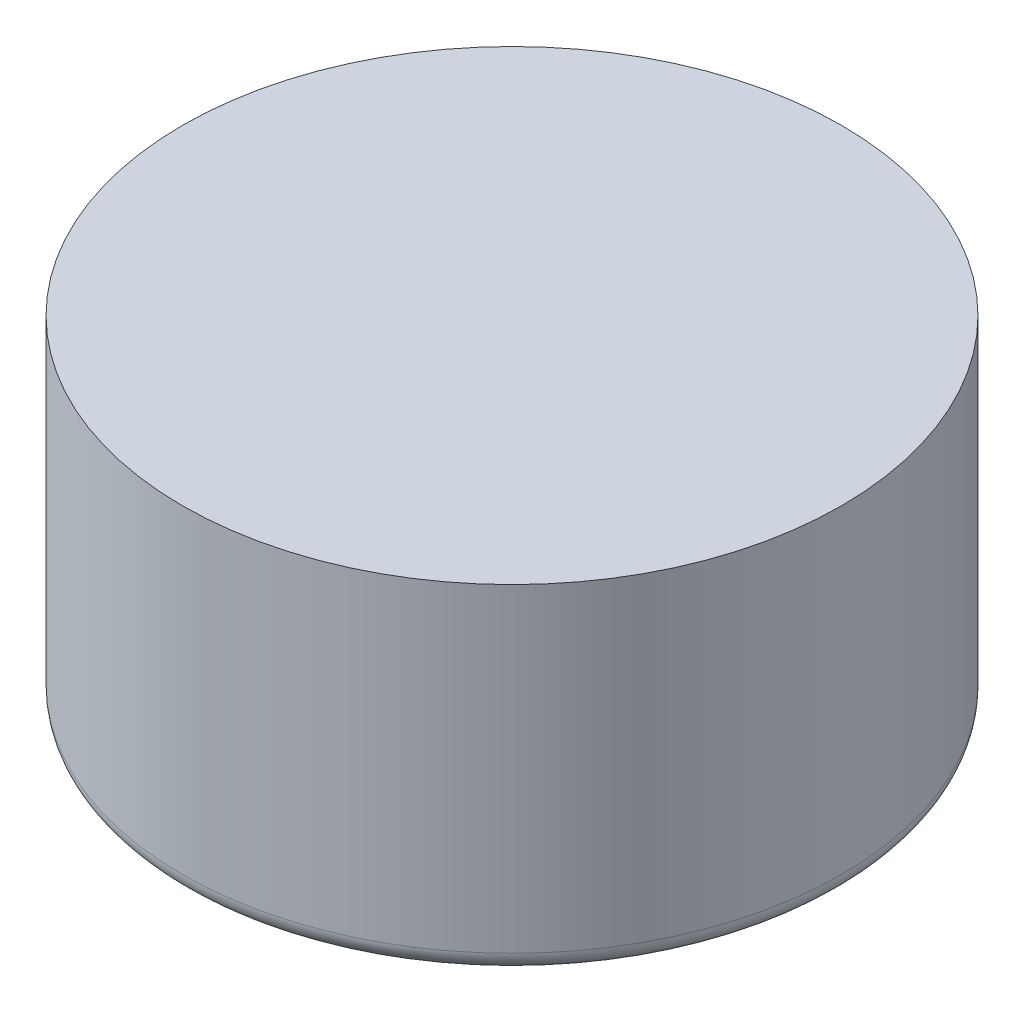
ISO-10303-21;
HEADER;
FILE_DESCRIPTION(('STEP AP214'),'2;1');
FILE_NAME('part.step','',(''),(''),'','','');
FILE_SCHEMA(('AUTOMOTIVE_DESIGN { 1 0 10303 214 1 1 1 1 }'));
ENDSEC;
DATA;
#1=APPLICATION_CONTEXT('core data for automotive mechanical design processes');
#2=APPLICATION_PROTOCOL_DEFINITION('international standard','automotive_design',2000,#1);
#3=PRODUCT_CONTEXT('',#1,'mechanical');
#4=PRODUCT('Part','Part','',(#3));
#5=PRODUCT_RELATED_PRODUCT_CATEGORY('part','',(#4));
#6=PRODUCT_DEFINITION_FORMATION('','',#4);
#7=PRODUCT_DEFINITION_CONTEXT('part definition',#1,'design');
#8=PRODUCT_DEFINITION('design','',#6,#7);
#9=PRODUCT_DEFINITION_SHAPE('','',#8);
#10=(LENGTH_UNIT() NAMED_UNIT(*) SI_UNIT(.MILLI.,.METRE.));
#11=(NAMED_UNIT(*) PLANE_ANGLE_UNIT() SI_UNIT($,.RADIAN.));
#12=(NAMED_UNIT(*) SI_UNIT($,.STERADIAN.) SOLID_ANGLE_UNIT());
#13=UNCERTAINTY_MEASURE_WITH_UNIT(LENGTH_MEASURE(1.E-05),#10,'distance_accuracy_value','');
#14=(GEOMETRIC_REPRESENTATION_CONTEXT(3) GLOBAL_UNCERTAINTY_ASSIGNED_CONTEXT((#13)) GLOBAL_UNIT_ASSIGNED_CONTEXT((#10,
#11,#12)) REPRESENTATION_CONTEXT('',''));
#15=CARTESIAN_POINT('',(0.,0.,0.));
#16=DIRECTION('',(0.,0.,1.));
#17=DIRECTION('',(1.,0.,0.));
#18=AXIS2_PLACEMENT_3D('',#15,#16,#17);
#19=CARTESIAN_POINT('',(0.,5.,0.));
#20=DIRECTION('',(0.,1.,0.));
#21=DIRECTION('',(1.,0.,0.));
#22=AXIS2_PLACEMENT_3D('',#19,#20,#21);
#23=PLANE('',#22);
#24=CARTESIAN_POINT('',(0.,5.,0.));
#25=DIRECTION('',(0.,1.,0.));
#26=DIRECTION('',(1.,0.,0.));
#27=AXIS2_PLACEMENT_3D('',#24,#25,#26);
#28=CIRCLE('',#27,4.85);
#29=CARTESIAN_POINT('',(-4.85,5.,0.));
#30=VERTEX_POINT('',#29);
#31=EDGE_CURVE('E74',#30,#30,#28,.T.);
#32=ORIENTED_EDGE('',*,*,#31,.T.);
#33=EDGE_LOOP('',(#32));
#34=FACE_BOUND('',#33,.T.);
#35=ADVANCED_FACE('F16',(#34),#23,.T.);
#36=CARTESIAN_POINT('',(0.,1.,0.));
#37=DIRECTION('',(0.,-1.,0.));
#38=DIRECTION('',(0.,0.,-1.));
#39=AXIS2_PLACEMENT_3D('',#36,#37,#38);
#40=PLANE('',#39);
#41=CARTESIAN_POINT('',(0.,1.,0.));
#42=DIRECTION('',(0.,1.,0.));
#43=DIRECTION('',(1.,0.,0.));
#44=AXIS2_PLACEMENT_3D('',#41,#42,#43);
#45=CIRCLE('',#44,4.);
#46=CARTESIAN_POINT('',(-4.,1.,0.));
#47=VERTEX_POINT('',#46);
#48=EDGE_CURVE('E10',#47,#47,#45,.T.);
#49=ORIENTED_EDGE('',*,*,#48,.F.);
#50=EDGE_LOOP('',(#49));
#51=FACE_BOUND('',#50,.T.);
#52=ADVANCED_FACE('F18',(#51),#40,.T.);
#53=CARTESIAN_POINT('',(0.,0.,0.));
#54=DIRECTION('',(0.,1.,0.));
#55=DIRECTION('',(1.,0.,0.));
#56=AXIS2_PLACEMENT_3D('',#53,#54,#55);
#57=CYLINDRICAL_SURFACE('',#56,4.);
#58=CARTESIAN_POINT('',(0.,0.3,0.));
#59=DIRECTION('',(0.,1.,0.));
#60=DIRECTION('',(1.,0.,0.));
#61=AXIS2_PLACEMENT_3D('',#58,#59,#60);
#62=CIRCLE('',#61,4.);
#63=CARTESIAN_POINT('',(-4.,0.3,0.));
#64=VERTEX_POINT('',#63);
#65=CARTESIAN_POINT('',(0.,0.3,-4.));
#66=VERTEX_POINT('',#65);
#67=EDGE_CURVE('E110',#64,#66,#62,.T.);
#68=ORIENTED_EDGE('',*,*,#67,.F.);
#69=DIRECTION('',(0.,1.,0.));
#70=VECTOR('',#69,1.);
#71=CARTESIAN_POINT('',(-4.,0.,0.));
#72=LINE('',#71,#70);
#73=EDGE_CURVE('E25',#64,#47,#72,.T.);
#74=ORIENTED_EDGE('',*,*,#73,.T.);
#75=ORIENTED_EDGE('',*,*,#48,.T.);
#76=ORIENTED_EDGE('',*,*,#73,.F.);
#77=CARTESIAN_POINT('',(0.,0.3,0.));
#78=DIRECTION('',(0.,1.,0.));
#79=DIRECTION('',(1.,0.,0.));
#80=AXIS2_PLACEMENT_3D('',#77,#78,#79);
#81=CIRCLE('',#80,4.);
#82=EDGE_CURVE('E107',#66,#64,#81,.T.);
#83=ORIENTED_EDGE('',*,*,#82,.F.);
#84=EDGE_LOOP('',(#68,#74,#75,#76,#83));
#85=FACE_BOUND('',#84,.T.);
#86=ADVANCED_FACE('F118',(#85),#57,.F.);
#87=CARTESIAN_POINT('',(0.,0.3,0.));
#88=DIRECTION('',(0.,1.,0.));
#89=DIRECTION('',(0.,0.,1.));
#90=AXIS2_PLACEMENT_3D('',#87,#88,#89);
#91=TOROIDAL_SURFACE('',#90,4.3,0.3);
#92=CARTESIAN_POINT('',(0.,0.,0.));
#93=DIRECTION('',(0.,-1.,0.));
#94=DIRECTION('',(1.,0.,0.));
#95=AXIS2_PLACEMENT_3D('',#92,#93,#94);
#96=CIRCLE('',#95,4.3);
#97=CARTESIAN_POINT('',(0.,0.,-4.3));
#98=VERTEX_POINT('',#97);
#99=EDGE_CURVE('E85',#98,#98,#96,.T.);
#100=ORIENTED_EDGE('',*,*,#99,.T.);
#101=CARTESIAN_POINT('',(0.,0.3,-4.3));
#102=DIRECTION('',(-1.,0.,0.));
#103=DIRECTION('',(0.,0.,-1.));
#104=AXIS2_PLACEMENT_3D('',#101,#102,#103);
#105=CIRCLE('',#104,0.3);
#106=EDGE_CURVE('E76',#98,#66,#105,.T.);
#107=ORIENTED_EDGE('',*,*,#106,.T.);
#108=ORIENTED_EDGE('',*,*,#82,.T.);
#109=ORIENTED_EDGE('',*,*,#67,.T.);
#110=ORIENTED_EDGE('',*,*,#106,.F.);
#111=EDGE_LOOP('',(#100,#107,#108,#109,#110));
#112=FACE_BOUND('',#111,.T.);
#113=ADVANCED_FACE('F119',(#112),#91,.T.);
#114=CARTESIAN_POINT('',(0.,0.,0.));
#115=DIRECTION('',(0.,1.,0.));
#116=DIRECTION('',(1.,0.,0.));
#117=AXIS2_PLACEMENT_3D('',#114,#115,#116);
#118=CYLINDRICAL_SURFACE('',#117,4.85);
#119=ORIENTED_EDGE('',*,*,#31,.F.);
#120=DIRECTION('',(0.,-1.,0.));
#121=VECTOR('',#120,1.);
#122=CARTESIAN_POINT('',(-4.85,0.,0.));
#123=LINE('',#122,#121);
#124=CARTESIAN_POINT('',(-4.85,0.3,0.));
#125=VERTEX_POINT('',#124);
#126=EDGE_CURVE('E67',#30,#125,#123,.T.);
#127=ORIENTED_EDGE('',*,*,#126,.T.);
#128=CARTESIAN_POINT('',(0.,0.3,0.));
#129=DIRECTION('',(0.,-1.,0.));
#130=DIRECTION('',(1.,0.,0.));
#131=AXIS2_PLACEMENT_3D('',#128,#129,#130);
#132=CIRCLE('',#131,4.85);
#133=CARTESIAN_POINT('',(0.,0.3,-4.85));
#134=VERTEX_POINT('',#133);
#135=EDGE_CURVE('E71',#134,#125,#132,.T.);
#136=ORIENTED_EDGE('',*,*,#135,.F.);
#137=CARTESIAN_POINT('',(0.,0.3,0.));
#138=DIRECTION('',(0.,-1.,0.));
#139=DIRECTION('',(1.,0.,0.));
#140=AXIS2_PLACEMENT_3D('',#137,#138,#139);
#141=CIRCLE('',#140,4.85);
#142=EDGE_CURVE('E82',#125,#134,#141,.T.);
#143=ORIENTED_EDGE('',*,*,#142,.F.);
#144=ORIENTED_EDGE('',*,*,#126,.F.);
#145=EDGE_LOOP('',(#119,#127,#136,#143,#144));
#146=FACE_BOUND('',#145,.T.);
#147=ADVANCED_FACE('F69',(#146),#118,.T.);
#148=CARTESIAN_POINT('',(0.,0.,0.));
#149=DIRECTION('',(0.,1.,0.));
#150=DIRECTION('',(1.,0.,0.));
#151=AXIS2_PLACEMENT_3D('',#148,#149,#150);
#152=PLANE('',#151);
#153=ORIENTED_EDGE('',*,*,#99,.F.);
#154=EDGE_LOOP('',(#153));
#155=FACE_BOUND('',#154,.T.);
#156=CARTESIAN_POINT('',(0.,0.,0.));
#157=DIRECTION('',(0.,1.,0.));
#158=DIRECTION('',(1.,0.,0.));
#159=AXIS2_PLACEMENT_3D('',#156,#157,#158);
#160=CIRCLE('',#159,4.55);
#161=CARTESIAN_POINT('',(0.,0.,-4.55));
#162=VERTEX_POINT('',#161);
#163=EDGE_CURVE('E86',#162,#162,#160,.T.);
#164=ORIENTED_EDGE('',*,*,#163,.F.);
#165=EDGE_LOOP('',(#164));
#166=FACE_BOUND('',#165,.T.);
#167=ADVANCED_FACE('F122',(#155,#166),#152,.F.);
#168=CARTESIAN_POINT('',(0.,0.3,0.));
#169=DIRECTION('',(0.,1.,0.));
#170=DIRECTION('',(0.,0.,1.));
#171=AXIS2_PLACEMENT_3D('',#168,#169,#170);
#172=TOROIDAL_SURFACE('',#171,4.55,0.3);
#173=ORIENTED_EDGE('',*,*,#142,.T.);
#174=CARTESIAN_POINT('',(0.,0.3,-4.55));
#175=DIRECTION('',(-1.,0.,0.));
#176=DIRECTION('',(0.,0.,-1.));
#177=AXIS2_PLACEMENT_3D('',#174,#175,#176);
#178=CIRCLE('',#177,0.3);
#179=EDGE_CURVE('E83',#134,#162,#178,.T.);
#180=ORIENTED_EDGE('',*,*,#179,.T.);
#181=ORIENTED_EDGE('',*,*,#163,.T.);
#182=ORIENTED_EDGE('',*,*,#179,.F.);
#183=ORIENTED_EDGE('',*,*,#135,.T.);
#184=EDGE_LOOP('',(#173,#180,#181,#182,#183));
#185=FACE_BOUND('',#184,.T.);
#186=ADVANCED_FACE('F80',(#185),#172,.T.);
#187=CLOSED_SHELL('',(#35,#52,#86,#113,#147,#167,#186));
#188=MANIFOLD_SOLID_BREP('B1',#187);
#189=ADVANCED_BREP_SHAPE_REPRESENTATION('',(#18,#188),#14);
#190=SHAPE_DEFINITION_REPRESENTATION(#9,#189);
ENDSEC;
END-ISO-10303-21;
